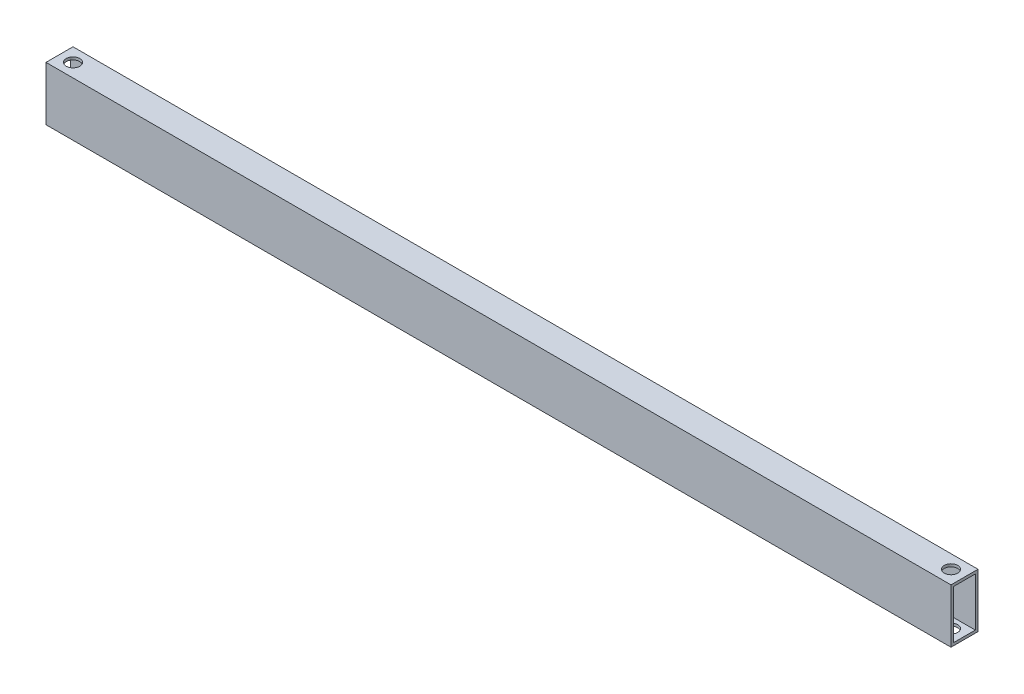
ISO-10303-21;
HEADER;
FILE_DESCRIPTION(('STEP AP214'),'2;1');
FILE_NAME('part.step','',(''),(''),'','','');
FILE_SCHEMA(('AUTOMOTIVE_DESIGN { 1 0 10303 214 1 1 1 1 }'));
ENDSEC;
DATA;
#1=APPLICATION_CONTEXT('core data for automotive mechanical design processes');
#2=APPLICATION_PROTOCOL_DEFINITION('international standard','automotive_design',2000,#1);
#3=PRODUCT_CONTEXT('',#1,'mechanical');
#4=PRODUCT('Part','Part','',(#3));
#5=PRODUCT_RELATED_PRODUCT_CATEGORY('part','',(#4));
#6=PRODUCT_DEFINITION_FORMATION('','',#4);
#7=PRODUCT_DEFINITION_CONTEXT('part definition',#1,'design');
#8=PRODUCT_DEFINITION('design','',#6,#7);
#9=PRODUCT_DEFINITION_SHAPE('','',#8);
#10=(LENGTH_UNIT() NAMED_UNIT(*) SI_UNIT(.MILLI.,.METRE.));
#11=(NAMED_UNIT(*) PLANE_ANGLE_UNIT() SI_UNIT($,.RADIAN.));
#12=(NAMED_UNIT(*) SI_UNIT($,.STERADIAN.) SOLID_ANGLE_UNIT());
#13=UNCERTAINTY_MEASURE_WITH_UNIT(LENGTH_MEASURE(1.E-05),#10,'distance_accuracy_value','');
#14=(GEOMETRIC_REPRESENTATION_CONTEXT(3) GLOBAL_UNCERTAINTY_ASSIGNED_CONTEXT((#13)) GLOBAL_UNIT_ASSIGNED_CONTEXT((#10,
#11,#12)) REPRESENTATION_CONTEXT('',''));
#15=CARTESIAN_POINT('',(0.,0.,0.));
#16=DIRECTION('',(0.,0.,1.));
#17=DIRECTION('',(1.,0.,0.));
#18=AXIS2_PLACEMENT_3D('',#15,#16,#17);
#19=CARTESIAN_POINT('',(-110.,-6.01063829787236,5.));
#20=DIRECTION('',(0.,0.,1.));
#21=DIRECTION('',(1.,0.,0.));
#22=AXIS2_PLACEMENT_3D('',#19,#20,#21);
#23=PLANE('',#22);
#24=DIRECTION('',(1.,0.,0.));
#25=VECTOR('',#24,1.);
#26=CARTESIAN_POINT('',(-110.,-6.01063829787236,5.));
#27=LINE('',#26,#25);
#28=CARTESIAN_POINT('',(-110.,-6.01063829787236,5.));
#29=VERTEX_POINT('',#28);
#30=CARTESIAN_POINT('',(225.,-6.01063829787236,5.));
#31=VERTEX_POINT('',#30);
#32=EDGE_CURVE('E172',#29,#31,#27,.T.);
#33=ORIENTED_EDGE('',*,*,#32,.T.);
#34=DIRECTION('',(0.,-1.,0.));
#35=VECTOR('',#34,1.);
#36=CARTESIAN_POINT('',(225.,-6.01063829787236,5.));
#37=LINE('',#36,#35);
#38=CARTESIAN_POINT('',(225.,13.9893617021276,5.));
#39=VERTEX_POINT('',#38);
#40=EDGE_CURVE('E140',#39,#31,#37,.T.);
#41=ORIENTED_EDGE('',*,*,#40,.F.);
#42=DIRECTION('',(1.,0.,0.));
#43=VECTOR('',#42,1.);
#44=CARTESIAN_POINT('',(-110.,13.9893617021276,5.));
#45=LINE('',#44,#43);
#46=CARTESIAN_POINT('',(-110.,13.9893617021276,5.));
#47=VERTEX_POINT('',#46);
#48=EDGE_CURVE('E11',#47,#39,#45,.T.);
#49=ORIENTED_EDGE('',*,*,#48,.F.);
#50=DIRECTION('',(0.,-1.,0.));
#51=VECTOR('',#50,1.);
#52=CARTESIAN_POINT('',(-110.,-6.01063829787236,5.));
#53=LINE('',#52,#51);
#54=EDGE_CURVE('E159',#47,#29,#53,.T.);
#55=ORIENTED_EDGE('',*,*,#54,.T.);
#56=EDGE_LOOP('',(#33,#41,#49,#55));
#57=FACE_BOUND('',#56,.T.);
#58=ADVANCED_FACE('F43',(#57),#23,.T.);
#59=CARTESIAN_POINT('',(-110.,13.9893617021276,-5.));
#60=DIRECTION('',(0.,1.,0.));
#61=DIRECTION('',(0.,0.,1.));
#62=AXIS2_PLACEMENT_3D('',#59,#60,#61);
#63=PLANE('',#62);
#64=CARTESIAN_POINT('',(-105.,13.9893617021276,0.));
#65=DIRECTION('',(0.,1.,0.));
#66=DIRECTION('',(0.,0.,1.));
#67=AXIS2_PLACEMENT_3D('',#64,#65,#66);
#68=CIRCLE('',#67,2.49999999999999);
#69=CARTESIAN_POINT('',(-105.,13.9893617021276,2.49999999999999));
#70=VERTEX_POINT('',#69);
#71=EDGE_CURVE('E186',#70,#70,#68,.T.);
#72=ORIENTED_EDGE('',*,*,#71,.F.);
#73=EDGE_LOOP('',(#72));
#74=FACE_BOUND('',#73,.T.);
#75=CARTESIAN_POINT('',(220.,13.9893617021276,0.));
#76=DIRECTION('',(0.,1.,0.));
#77=DIRECTION('',(0.,0.,1.));
#78=AXIS2_PLACEMENT_3D('',#75,#76,#77);
#79=CIRCLE('',#78,2.5);
#80=CARTESIAN_POINT('',(220.,13.9893617021276,2.5));
#81=VERTEX_POINT('',#80);
#82=EDGE_CURVE('E191',#81,#81,#79,.T.);
#83=ORIENTED_EDGE('',*,*,#82,.F.);
#84=EDGE_LOOP('',(#83));
#85=FACE_BOUND('',#84,.T.);
#86=ORIENTED_EDGE('',*,*,#48,.T.);
#87=DIRECTION('',(0.,0.,1.));
#88=VECTOR('',#87,1.);
#89=CARTESIAN_POINT('',(225.,13.9893617021276,-5.));
#90=LINE('',#89,#88);
#91=CARTESIAN_POINT('',(225.,13.9893617021276,-5.));
#92=VERTEX_POINT('',#91);
#93=EDGE_CURVE('E149',#92,#39,#90,.T.);
#94=ORIENTED_EDGE('',*,*,#93,.F.);
#95=DIRECTION('',(1.,0.,0.));
#96=VECTOR('',#95,1.);
#97=CARTESIAN_POINT('',(-110.,13.9893617021276,-5.));
#98=LINE('',#97,#96);
#99=CARTESIAN_POINT('',(-110.,13.9893617021276,-5.));
#100=VERTEX_POINT('',#99);
#101=EDGE_CURVE('E51',#100,#92,#98,.T.);
#102=ORIENTED_EDGE('',*,*,#101,.F.);
#103=DIRECTION('',(0.,0.,1.));
#104=VECTOR('',#103,1.);
#105=CARTESIAN_POINT('',(-110.,13.9893617021276,-5.));
#106=LINE('',#105,#104);
#107=EDGE_CURVE('E170',#100,#47,#106,.T.);
#108=ORIENTED_EDGE('',*,*,#107,.T.);
#109=EDGE_LOOP('',(#86,#94,#102,#108));
#110=FACE_BOUND('',#109,.T.);
#111=ADVANCED_FACE('F243',(#74,#85,#110),#63,.T.);
#112=CARTESIAN_POINT('',(-110.,-6.01063829787236,-5.));
#113=DIRECTION('',(0.,0.,-1.));
#114=DIRECTION('',(-1.,0.,0.));
#115=AXIS2_PLACEMENT_3D('',#112,#113,#114);
#116=PLANE('',#115);
#117=CARTESIAN_POINT('',(19.85,3.98936170212764,-5.));
#118=DIRECTION('',(0.,0.,-1.));
#119=DIRECTION('',(-1.,0.,0.));
#120=AXIS2_PLACEMENT_3D('',#117,#118,#119);
#121=CIRCLE('',#120,2.5);
#122=CARTESIAN_POINT('',(17.35,3.98936170212764,-5.));
#123=VERTEX_POINT('',#122);
#124=EDGE_CURVE('E205',#123,#123,#121,.T.);
#125=ORIENTED_EDGE('',*,*,#124,.F.);
#126=EDGE_LOOP('',(#125));
#127=FACE_BOUND('',#126,.T.);
#128=CARTESIAN_POINT('',(10.,3.98936170212764,-5.));
#129=DIRECTION('',(0.,0.,-1.));
#130=DIRECTION('',(-1.,0.,0.));
#131=AXIS2_PLACEMENT_3D('',#128,#129,#130);
#132=CIRCLE('',#131,2.5);
#133=CARTESIAN_POINT('',(7.5,3.98936170212764,-5.));
#134=VERTEX_POINT('',#133);
#135=EDGE_CURVE('E208',#134,#134,#132,.T.);
#136=ORIENTED_EDGE('',*,*,#135,.F.);
#137=EDGE_LOOP('',(#136));
#138=FACE_BOUND('',#137,.T.);
#139=CARTESIAN_POINT('',(0.,3.98936170212764,-5.));
#140=DIRECTION('',(0.,0.,-1.));
#141=DIRECTION('',(-1.,0.,0.));
#142=AXIS2_PLACEMENT_3D('',#139,#140,#141);
#143=CIRCLE('',#142,2.5);
#144=CARTESIAN_POINT('',(-2.5,3.98936170212764,-5.));
#145=VERTEX_POINT('',#144);
#146=EDGE_CURVE('E214',#145,#145,#143,.T.);
#147=ORIENTED_EDGE('',*,*,#146,.F.);
#148=EDGE_LOOP('',(#147));
#149=FACE_BOUND('',#148,.T.);
#150=CARTESIAN_POINT('',(-10.,3.98936170212764,-5.));
#151=DIRECTION('',(0.,0.,-1.));
#152=DIRECTION('',(1.,0.,0.));
#153=AXIS2_PLACEMENT_3D('',#150,#151,#152);
#154=CIRCLE('',#153,2.5);
#155=CARTESIAN_POINT('',(-7.5,3.98936170212764,-5.));
#156=VERTEX_POINT('',#155);
#157=EDGE_CURVE('E220',#156,#156,#154,.T.);
#158=ORIENTED_EDGE('',*,*,#157,.F.);
#159=EDGE_LOOP('',(#158));
#160=FACE_BOUND('',#159,.T.);
#161=CARTESIAN_POINT('',(-19.85,3.98936170212764,-5.));
#162=DIRECTION('',(0.,0.,-1.));
#163=DIRECTION('',(1.,0.,0.));
#164=AXIS2_PLACEMENT_3D('',#161,#162,#163);
#165=CIRCLE('',#164,2.5);
#166=CARTESIAN_POINT('',(-17.35,3.98936170212764,-5.));
#167=VERTEX_POINT('',#166);
#168=EDGE_CURVE('E226',#167,#167,#165,.T.);
#169=ORIENTED_EDGE('',*,*,#168,.F.);
#170=EDGE_LOOP('',(#169));
#171=FACE_BOUND('',#170,.T.);
#172=ORIENTED_EDGE('',*,*,#101,.T.);
#173=DIRECTION('',(0.,1.,0.));
#174=VECTOR('',#173,1.);
#175=CARTESIAN_POINT('',(225.,-6.01063829787236,-5.));
#176=LINE('',#175,#174);
#177=CARTESIAN_POINT('',(225.,-6.01063829787236,-5.));
#178=VERTEX_POINT('',#177);
#179=EDGE_CURVE('E146',#178,#92,#176,.T.);
#180=ORIENTED_EDGE('',*,*,#179,.F.);
#181=DIRECTION('',(1.,0.,0.));
#182=VECTOR('',#181,1.);
#183=CARTESIAN_POINT('',(-110.,-6.01063829787236,-5.));
#184=LINE('',#183,#182);
#185=CARTESIAN_POINT('',(-110.,-6.01063829787236,-5.));
#186=VERTEX_POINT('',#185);
#187=EDGE_CURVE('E175',#186,#178,#184,.T.);
#188=ORIENTED_EDGE('',*,*,#187,.F.);
#189=DIRECTION('',(0.,1.,0.));
#190=VECTOR('',#189,1.);
#191=CARTESIAN_POINT('',(-110.,-6.01063829787236,-5.));
#192=LINE('',#191,#190);
#193=EDGE_CURVE('E167',#186,#100,#192,.T.);
#194=ORIENTED_EDGE('',*,*,#193,.T.);
#195=EDGE_LOOP('',(#172,#180,#188,#194));
#196=FACE_BOUND('',#195,.T.);
#197=ADVANCED_FACE('F239',(#127,#138,#149,#160,#171,#196),#116,.T.);
#198=CARTESIAN_POINT('',(-110.,-6.01063829787236,-5.));
#199=DIRECTION('',(0.,-1.,0.));
#200=DIRECTION('',(0.,0.,-1.));
#201=AXIS2_PLACEMENT_3D('',#198,#199,#200);
#202=PLANE('',#201);
#203=CARTESIAN_POINT('',(-105.,-6.01063829787236,0.));
#204=DIRECTION('',(0.,1.,0.));
#205=DIRECTION('',(0.,0.,1.));
#206=AXIS2_PLACEMENT_3D('',#203,#204,#205);
#207=CIRCLE('',#206,2.49999999999999);
#208=CARTESIAN_POINT('',(-105.,-6.01063829787236,2.49999999999999));
#209=VERTEX_POINT('',#208);
#210=EDGE_CURVE('E180',#209,#209,#207,.T.);
#211=ORIENTED_EDGE('',*,*,#210,.T.);
#212=EDGE_LOOP('',(#211));
#213=FACE_BOUND('',#212,.T.);
#214=CARTESIAN_POINT('',(220.,-6.01063829787236,0.));
#215=DIRECTION('',(0.,1.,0.));
#216=DIRECTION('',(0.,0.,1.));
#217=AXIS2_PLACEMENT_3D('',#214,#215,#216);
#218=CIRCLE('',#217,2.5);
#219=CARTESIAN_POINT('',(220.,-6.01063829787236,2.5));
#220=VERTEX_POINT('',#219);
#221=EDGE_CURVE('E196',#220,#220,#218,.T.);
#222=ORIENTED_EDGE('',*,*,#221,.T.);
#223=EDGE_LOOP('',(#222));
#224=FACE_BOUND('',#223,.T.);
#225=ORIENTED_EDGE('',*,*,#187,.T.);
#226=DIRECTION('',(0.,0.,-1.));
#227=VECTOR('',#226,1.);
#228=CARTESIAN_POINT('',(225.,-6.01063829787236,-5.));
#229=LINE('',#228,#227);
#230=EDGE_CURVE('E143',#31,#178,#229,.T.);
#231=ORIENTED_EDGE('',*,*,#230,.F.);
#232=ORIENTED_EDGE('',*,*,#32,.F.);
#233=DIRECTION('',(0.,0.,-1.));
#234=VECTOR('',#233,1.);
#235=CARTESIAN_POINT('',(-110.,-6.01063829787236,-5.));
#236=LINE('',#235,#234);
#237=EDGE_CURVE('E164',#29,#186,#236,.T.);
#238=ORIENTED_EDGE('',*,*,#237,.T.);
#239=EDGE_LOOP('',(#225,#231,#232,#238));
#240=FACE_BOUND('',#239,.T.);
#241=ADVANCED_FACE('F242',(#213,#224,#240),#202,.T.);
#242=CARTESIAN_POINT('',(-110.,0.,0.));
#243=DIRECTION('',(1.,0.,0.));
#244=DIRECTION('',(0.,0.,-1.));
#245=AXIS2_PLACEMENT_3D('',#242,#243,#244);
#246=PLANE('',#245);
#247=DIRECTION('',(0.,-1.,0.));
#248=VECTOR('',#247,1.);
#249=CARTESIAN_POINT('',(-110.,-5.01063829787236,4.));
#250=LINE('',#249,#248);
#251=CARTESIAN_POINT('',(-110.,12.9893617021276,4.));
#252=VERTEX_POINT('',#251);
#253=CARTESIAN_POINT('',(-110.,-5.01063829787236,4.));
#254=VERTEX_POINT('',#253);
#255=EDGE_CURVE('E120',#252,#254,#250,.T.);
#256=ORIENTED_EDGE('',*,*,#255,.T.);
#257=DIRECTION('',(0.,0.,-1.));
#258=VECTOR('',#257,1.);
#259=CARTESIAN_POINT('',(-110.,-5.01063829787236,-4.));
#260=LINE('',#259,#258);
#261=CARTESIAN_POINT('',(-110.,-5.01063829787236,-4.));
#262=VERTEX_POINT('',#261);
#263=EDGE_CURVE('E152',#254,#262,#260,.T.);
#264=ORIENTED_EDGE('',*,*,#263,.T.);
#265=DIRECTION('',(0.,1.,0.));
#266=VECTOR('',#265,1.);
#267=CARTESIAN_POINT('',(-110.,-5.01063829787236,-4.));
#268=LINE('',#267,#266);
#269=CARTESIAN_POINT('',(-110.,12.9893617021276,-4.));
#270=VERTEX_POINT('',#269);
#271=EDGE_CURVE('E115',#262,#270,#268,.T.);
#272=ORIENTED_EDGE('',*,*,#271,.T.);
#273=DIRECTION('',(0.,0.,1.));
#274=VECTOR('',#273,1.);
#275=CARTESIAN_POINT('',(-110.,12.9893617021276,-4.));
#276=LINE('',#275,#274);
#277=EDGE_CURVE('E59',#270,#252,#276,.T.);
#278=ORIENTED_EDGE('',*,*,#277,.T.);
#279=EDGE_LOOP('',(#256,#264,#272,#278));
#280=FACE_BOUND('',#279,.T.);
#281=ORIENTED_EDGE('',*,*,#54,.F.);
#282=ORIENTED_EDGE('',*,*,#107,.F.);
#283=ORIENTED_EDGE('',*,*,#193,.F.);
#284=ORIENTED_EDGE('',*,*,#237,.F.);
#285=EDGE_LOOP('',(#281,#282,#283,#284));
#286=FACE_BOUND('',#285,.T.);
#287=ADVANCED_FACE('F254',(#280,#286),#246,.F.);
#288=CARTESIAN_POINT('',(-110.,-5.01063829787236,-4.));
#289=DIRECTION('',(0.,-1.,0.));
#290=DIRECTION('',(0.,0.,-1.));
#291=AXIS2_PLACEMENT_3D('',#288,#289,#290);
#292=PLANE('',#291);
#293=CARTESIAN_POINT('',(-105.,-5.01063829787236,0.));
#294=DIRECTION('',(0.,-1.,0.));
#295=DIRECTION('',(0.,0.,-1.));
#296=AXIS2_PLACEMENT_3D('',#293,#294,#295);
#297=CIRCLE('',#296,2.49999999999999);
#298=CARTESIAN_POINT('',(-105.,-5.01063829787236,-2.49999999999999));
#299=VERTEX_POINT('',#298);
#300=EDGE_CURVE('E199',#299,#299,#297,.T.);
#301=ORIENTED_EDGE('',*,*,#300,.T.);
#302=EDGE_LOOP('',(#301));
#303=FACE_BOUND('',#302,.T.);
#304=CARTESIAN_POINT('',(220.,-5.01063829787236,0.));
#305=DIRECTION('',(0.,-1.,0.));
#306=DIRECTION('',(0.,0.,-1.));
#307=AXIS2_PLACEMENT_3D('',#304,#305,#306);
#308=CIRCLE('',#307,2.5);
#309=CARTESIAN_POINT('',(220.,-5.01063829787236,-2.49999999999999));
#310=VERTEX_POINT('',#309);
#311=EDGE_CURVE('E179',#310,#310,#308,.T.);
#312=ORIENTED_EDGE('',*,*,#311,.T.);
#313=EDGE_LOOP('',(#312));
#314=FACE_BOUND('',#313,.T.);
#315=DIRECTION('',(1.,0.,0.));
#316=VECTOR('',#315,1.);
#317=CARTESIAN_POINT('',(-110.,-5.01063829787236,4.));
#318=LINE('',#317,#316);
#319=CARTESIAN_POINT('',(225.,-5.01063829787236,4.));
#320=VERTEX_POINT('',#319);
#321=EDGE_CURVE('E125',#254,#320,#318,.T.);
#322=ORIENTED_EDGE('',*,*,#321,.T.);
#323=DIRECTION('',(0.,0.,-1.));
#324=VECTOR('',#323,1.);
#325=CARTESIAN_POINT('',(225.,-5.01063829787236,-4.));
#326=LINE('',#325,#324);
#327=CARTESIAN_POINT('',(225.,-5.01063829787236,-4.));
#328=VERTEX_POINT('',#327);
#329=EDGE_CURVE('E123',#320,#328,#326,.T.);
#330=ORIENTED_EDGE('',*,*,#329,.T.);
#331=DIRECTION('',(1.,0.,0.));
#332=VECTOR('',#331,1.);
#333=CARTESIAN_POINT('',(-110.,-5.01063829787236,-4.));
#334=LINE('',#333,#332);
#335=EDGE_CURVE('E108',#262,#328,#334,.T.);
#336=ORIENTED_EDGE('',*,*,#335,.F.);
#337=ORIENTED_EDGE('',*,*,#263,.F.);
#338=EDGE_LOOP('',(#322,#330,#336,#337));
#339=FACE_BOUND('',#338,.T.);
#340=ADVANCED_FACE('F124',(#303,#314,#339),#292,.F.);
#341=CARTESIAN_POINT('',(-110.,-5.01063829787236,4.));
#342=DIRECTION('',(0.,0.,1.));
#343=DIRECTION('',(0.,-1.,0.));
#344=AXIS2_PLACEMENT_3D('',#341,#342,#343);
#345=PLANE('',#344);
#346=DIRECTION('',(1.,0.,0.));
#347=VECTOR('',#346,1.);
#348=CARTESIAN_POINT('',(-110.,12.9893617021276,4.));
#349=LINE('',#348,#347);
#350=CARTESIAN_POINT('',(225.,12.9893617021276,4.));
#351=VERTEX_POINT('',#350);
#352=EDGE_CURVE('E160',#252,#351,#349,.T.);
#353=ORIENTED_EDGE('',*,*,#352,.T.);
#354=DIRECTION('',(0.,-1.,0.));
#355=VECTOR('',#354,1.);
#356=CARTESIAN_POINT('',(225.,-5.01063829787236,4.));
#357=LINE('',#356,#355);
#358=EDGE_CURVE('E135',#351,#320,#357,.T.);
#359=ORIENTED_EDGE('',*,*,#358,.T.);
#360=ORIENTED_EDGE('',*,*,#321,.F.);
#361=ORIENTED_EDGE('',*,*,#255,.F.);
#362=EDGE_LOOP('',(#353,#359,#360,#361));
#363=FACE_BOUND('',#362,.T.);
#364=ADVANCED_FACE('F278',(#363),#345,.F.);
#365=CARTESIAN_POINT('',(-110.,12.9893617021276,-4.));
#366=DIRECTION('',(0.,1.,0.));
#367=DIRECTION('',(0.,0.,1.));
#368=AXIS2_PLACEMENT_3D('',#365,#366,#367);
#369=PLANE('',#368);
#370=CARTESIAN_POINT('',(-105.,12.9893617021276,0.));
#371=DIRECTION('',(0.,1.,0.));
#372=DIRECTION('',(0.,0.,1.));
#373=AXIS2_PLACEMENT_3D('',#370,#371,#372);
#374=CIRCLE('',#373,2.49999999999999);
#375=CARTESIAN_POINT('',(-105.,12.9893617021276,2.49999999999999));
#376=VERTEX_POINT('',#375);
#377=EDGE_CURVE('E46',#376,#376,#374,.T.);
#378=ORIENTED_EDGE('',*,*,#377,.T.);
#379=EDGE_LOOP('',(#378));
#380=FACE_BOUND('',#379,.T.);
#381=CARTESIAN_POINT('',(220.,12.9893617021276,0.));
#382=DIRECTION('',(0.,1.,0.));
#383=DIRECTION('',(0.,0.,1.));
#384=AXIS2_PLACEMENT_3D('',#381,#382,#383);
#385=CIRCLE('',#384,2.5);
#386=CARTESIAN_POINT('',(220.,12.9893617021276,2.5));
#387=VERTEX_POINT('',#386);
#388=EDGE_CURVE('E177',#387,#387,#385,.T.);
#389=ORIENTED_EDGE('',*,*,#388,.T.);
#390=EDGE_LOOP('',(#389));
#391=FACE_BOUND('',#390,.T.);
#392=DIRECTION('',(1.,0.,0.));
#393=VECTOR('',#392,1.);
#394=CARTESIAN_POINT('',(-110.,12.9893617021276,-4.));
#395=LINE('',#394,#393);
#396=CARTESIAN_POINT('',(225.,12.9893617021276,-4.));
#397=VERTEX_POINT('',#396);
#398=EDGE_CURVE('E119',#270,#397,#395,.T.);
#399=ORIENTED_EDGE('',*,*,#398,.T.);
#400=DIRECTION('',(0.,0.,1.));
#401=VECTOR('',#400,1.);
#402=CARTESIAN_POINT('',(225.,12.9893617021276,-4.));
#403=LINE('',#402,#401);
#404=EDGE_CURVE('E133',#397,#351,#403,.T.);
#405=ORIENTED_EDGE('',*,*,#404,.T.);
#406=ORIENTED_EDGE('',*,*,#352,.F.);
#407=ORIENTED_EDGE('',*,*,#277,.F.);
#408=EDGE_LOOP('',(#399,#405,#406,#407));
#409=FACE_BOUND('',#408,.T.);
#410=ADVANCED_FACE('F282',(#380,#391,#409),#369,.F.);
#411=CARTESIAN_POINT('',(-110.,-5.01063829787236,-4.));
#412=DIRECTION('',(0.,0.,-1.));
#413=DIRECTION('',(-1.,0.,0.));
#414=AXIS2_PLACEMENT_3D('',#411,#412,#413);
#415=PLANE('',#414);
#416=CARTESIAN_POINT('',(19.85,3.98936170212764,-4.));
#417=DIRECTION('',(0.,0.,-1.));
#418=DIRECTION('',(-1.,0.,0.));
#419=AXIS2_PLACEMENT_3D('',#416,#417,#418);
#420=CIRCLE('',#419,2.5);
#421=CARTESIAN_POINT('',(17.35,3.98936170212764,-4.));
#422=VERTEX_POINT('',#421);
#423=EDGE_CURVE('E129',#422,#422,#420,.T.);
#424=ORIENTED_EDGE('',*,*,#423,.T.);
#425=EDGE_LOOP('',(#424));
#426=FACE_BOUND('',#425,.T.);
#427=CARTESIAN_POINT('',(10.,3.98936170212764,-4.));
#428=DIRECTION('',(0.,0.,-1.));
#429=DIRECTION('',(-1.,0.,0.));
#430=AXIS2_PLACEMENT_3D('',#427,#428,#429);
#431=CIRCLE('',#430,2.5);
#432=CARTESIAN_POINT('',(7.5,3.98936170212764,-4.));
#433=VERTEX_POINT('',#432);
#434=EDGE_CURVE('E211',#433,#433,#431,.T.);
#435=ORIENTED_EDGE('',*,*,#434,.T.);
#436=EDGE_LOOP('',(#435));
#437=FACE_BOUND('',#436,.T.);
#438=CARTESIAN_POINT('',(0.,3.98936170212764,-4.));
#439=DIRECTION('',(0.,0.,-1.));
#440=DIRECTION('',(-1.,0.,0.));
#441=AXIS2_PLACEMENT_3D('',#438,#439,#440);
#442=CIRCLE('',#441,2.5);
#443=CARTESIAN_POINT('',(-2.5,3.98936170212764,-4.));
#444=VERTEX_POINT('',#443);
#445=EDGE_CURVE('E217',#444,#444,#442,.T.);
#446=ORIENTED_EDGE('',*,*,#445,.T.);
#447=EDGE_LOOP('',(#446));
#448=FACE_BOUND('',#447,.T.);
#449=CARTESIAN_POINT('',(-10.,3.98936170212764,-4.));
#450=DIRECTION('',(0.,0.,-1.));
#451=DIRECTION('',(1.,0.,0.));
#452=AXIS2_PLACEMENT_3D('',#449,#450,#451);
#453=CIRCLE('',#452,2.5);
#454=CARTESIAN_POINT('',(-7.5,3.98936170212764,-4.));
#455=VERTEX_POINT('',#454);
#456=EDGE_CURVE('E223',#455,#455,#453,.T.);
#457=ORIENTED_EDGE('',*,*,#456,.T.);
#458=EDGE_LOOP('',(#457));
#459=FACE_BOUND('',#458,.T.);
#460=CARTESIAN_POINT('',(-19.85,3.98936170212764,-4.));
#461=DIRECTION('',(0.,0.,-1.));
#462=DIRECTION('',(1.,0.,0.));
#463=AXIS2_PLACEMENT_3D('',#460,#461,#462);
#464=CIRCLE('',#463,2.5);
#465=CARTESIAN_POINT('',(-17.35,3.98936170212764,-4.));
#466=VERTEX_POINT('',#465);
#467=EDGE_CURVE('E202',#466,#466,#464,.T.);
#468=ORIENTED_EDGE('',*,*,#467,.T.);
#469=EDGE_LOOP('',(#468));
#470=FACE_BOUND('',#469,.T.);
#471=ORIENTED_EDGE('',*,*,#335,.T.);
#472=DIRECTION('',(0.,1.,0.));
#473=VECTOR('',#472,1.);
#474=CARTESIAN_POINT('',(225.,-5.01063829787236,-4.));
#475=LINE('',#474,#473);
#476=EDGE_CURVE('E112',#328,#397,#475,.T.);
#477=ORIENTED_EDGE('',*,*,#476,.T.);
#478=ORIENTED_EDGE('',*,*,#398,.F.);
#479=ORIENTED_EDGE('',*,*,#271,.F.);
#480=EDGE_LOOP('',(#471,#477,#478,#479));
#481=FACE_BOUND('',#480,.T.);
#482=ADVANCED_FACE('F110',(#426,#437,#448,#459,#470,#481),#415,.F.);
#483=CARTESIAN_POINT('',(225.,0.,0.));
#484=DIRECTION('',(1.,0.,0.));
#485=DIRECTION('',(0.,0.,-1.));
#486=AXIS2_PLACEMENT_3D('',#483,#484,#485);
#487=PLANE('',#486);
#488=ORIENTED_EDGE('',*,*,#40,.T.);
#489=ORIENTED_EDGE('',*,*,#230,.T.);
#490=ORIENTED_EDGE('',*,*,#179,.T.);
#491=ORIENTED_EDGE('',*,*,#93,.T.);
#492=EDGE_LOOP('',(#488,#489,#490,#491));
#493=FACE_BOUND('',#492,.T.);
#494=ORIENTED_EDGE('',*,*,#476,.F.);
#495=ORIENTED_EDGE('',*,*,#329,.F.);
#496=ORIENTED_EDGE('',*,*,#358,.F.);
#497=ORIENTED_EDGE('',*,*,#404,.F.);
#498=EDGE_LOOP('',(#494,#495,#496,#497));
#499=FACE_BOUND('',#498,.T.);
#500=ADVANCED_FACE('F131',(#493,#499),#487,.T.);
#501=CARTESIAN_POINT('',(-19.85,3.98936170212764,-4.));
#502=DIRECTION('',(0.,0.,-1.));
#503=DIRECTION('',(-1.,0.,0.));
#504=AXIS2_PLACEMENT_3D('',#501,#502,#503);
#505=CYLINDRICAL_SURFACE('',#504,2.5);
#506=ORIENTED_EDGE('',*,*,#467,.F.);
#507=EDGE_LOOP('',(#506));
#508=FACE_BOUND('',#507,.T.);
#509=ORIENTED_EDGE('',*,*,#168,.T.);
#510=EDGE_LOOP('',(#509));
#511=FACE_BOUND('',#510,.T.);
#512=ADVANCED_FACE('F232',(#508,#511),#505,.F.);
#513=CARTESIAN_POINT('',(-10.,3.98936170212764,-4.));
#514=DIRECTION('',(0.,0.,-1.));
#515=DIRECTION('',(-1.,0.,0.));
#516=AXIS2_PLACEMENT_3D('',#513,#514,#515);
#517=CYLINDRICAL_SURFACE('',#516,2.5);
#518=ORIENTED_EDGE('',*,*,#456,.F.);
#519=EDGE_LOOP('',(#518));
#520=FACE_BOUND('',#519,.T.);
#521=ORIENTED_EDGE('',*,*,#157,.T.);
#522=EDGE_LOOP('',(#521));
#523=FACE_BOUND('',#522,.T.);
#524=ADVANCED_FACE('F235',(#520,#523),#517,.F.);
#525=CARTESIAN_POINT('',(0.,3.98936170212764,-4.));
#526=DIRECTION('',(0.,0.,-1.));
#527=DIRECTION('',(-1.,0.,0.));
#528=AXIS2_PLACEMENT_3D('',#525,#526,#527);
#529=CYLINDRICAL_SURFACE('',#528,2.5);
#530=ORIENTED_EDGE('',*,*,#445,.F.);
#531=EDGE_LOOP('',(#530));
#532=FACE_BOUND('',#531,.T.);
#533=ORIENTED_EDGE('',*,*,#146,.T.);
#534=EDGE_LOOP('',(#533));
#535=FACE_BOUND('',#534,.T.);
#536=ADVANCED_FACE('F294',(#532,#535),#529,.F.);
#537=CARTESIAN_POINT('',(10.,3.98936170212764,-4.));
#538=DIRECTION('',(0.,0.,-1.));
#539=DIRECTION('',(-1.,0.,0.));
#540=AXIS2_PLACEMENT_3D('',#537,#538,#539);
#541=CYLINDRICAL_SURFACE('',#540,2.5);
#542=ORIENTED_EDGE('',*,*,#434,.F.);
#543=EDGE_LOOP('',(#542));
#544=FACE_BOUND('',#543,.T.);
#545=ORIENTED_EDGE('',*,*,#135,.T.);
#546=EDGE_LOOP('',(#545));
#547=FACE_BOUND('',#546,.T.);
#548=ADVANCED_FACE('F298',(#544,#547),#541,.F.);
#549=CARTESIAN_POINT('',(19.85,3.98936170212764,-4.));
#550=DIRECTION('',(0.,0.,-1.));
#551=DIRECTION('',(-1.,0.,0.));
#552=AXIS2_PLACEMENT_3D('',#549,#550,#551);
#553=CYLINDRICAL_SURFACE('',#552,2.5);
#554=ORIENTED_EDGE('',*,*,#423,.F.);
#555=EDGE_LOOP('',(#554));
#556=FACE_BOUND('',#555,.T.);
#557=ORIENTED_EDGE('',*,*,#124,.T.);
#558=EDGE_LOOP('',(#557));
#559=FACE_BOUND('',#558,.T.);
#560=ADVANCED_FACE('F302',(#556,#559),#553,.F.);
#561=CARTESIAN_POINT('',(220.,-6.01063829787236,0.));
#562=DIRECTION('',(0.,1.,0.));
#563=DIRECTION('',(0.,0.,1.));
#564=AXIS2_PLACEMENT_3D('',#561,#562,#563);
#565=CYLINDRICAL_SURFACE('',#564,2.5);
#566=ORIENTED_EDGE('',*,*,#82,.T.);
#567=EDGE_LOOP('',(#566));
#568=FACE_BOUND('',#567,.T.);
#569=ORIENTED_EDGE('',*,*,#388,.F.);
#570=EDGE_LOOP('',(#569));
#571=FACE_BOUND('',#570,.T.);
#572=ADVANCED_FACE('F305',(#568,#571),#565,.F.);
#573=CARTESIAN_POINT('',(-105.,-6.01063829787236,0.));
#574=DIRECTION('',(0.,1.,0.));
#575=DIRECTION('',(0.,0.,1.));
#576=AXIS2_PLACEMENT_3D('',#573,#574,#575);
#577=CYLINDRICAL_SURFACE('',#576,2.49999999999999);
#578=ORIENTED_EDGE('',*,*,#71,.T.);
#579=EDGE_LOOP('',(#578));
#580=FACE_BOUND('',#579,.T.);
#581=ORIENTED_EDGE('',*,*,#377,.F.);
#582=EDGE_LOOP('',(#581));
#583=FACE_BOUND('',#582,.T.);
#584=ADVANCED_FACE('F311',(#580,#583),#577,.F.);
#585=ORIENTED_EDGE('',*,*,#221,.F.);
#586=EDGE_LOOP('',(#585));
#587=FACE_BOUND('',#586,.T.);
#588=ORIENTED_EDGE('',*,*,#311,.F.);
#589=EDGE_LOOP('',(#588));
#590=FACE_BOUND('',#589,.T.);
#591=ADVANCED_FACE('F307',(#587,#590),#565,.F.);
#592=ORIENTED_EDGE('',*,*,#210,.F.);
#593=EDGE_LOOP('',(#592));
#594=FACE_BOUND('',#593,.T.);
#595=ORIENTED_EDGE('',*,*,#300,.F.);
#596=EDGE_LOOP('',(#595));
#597=FACE_BOUND('',#596,.T.);
#598=ADVANCED_FACE('F310',(#594,#597),#577,.F.);
#599=CLOSED_SHELL('',(#58,#111,#197,#241,#287,#340,#364,#410,#482,#500,#512,#524,#536,#548,#560,
#572,#584,#591,#598));
#600=MANIFOLD_SOLID_BREP('B2',#599);
#601=ADVANCED_BREP_SHAPE_REPRESENTATION('',(#18,#600),#14);
#602=SHAPE_DEFINITION_REPRESENTATION(#9,#601);
ENDSEC;
END-ISO-10303-21;
